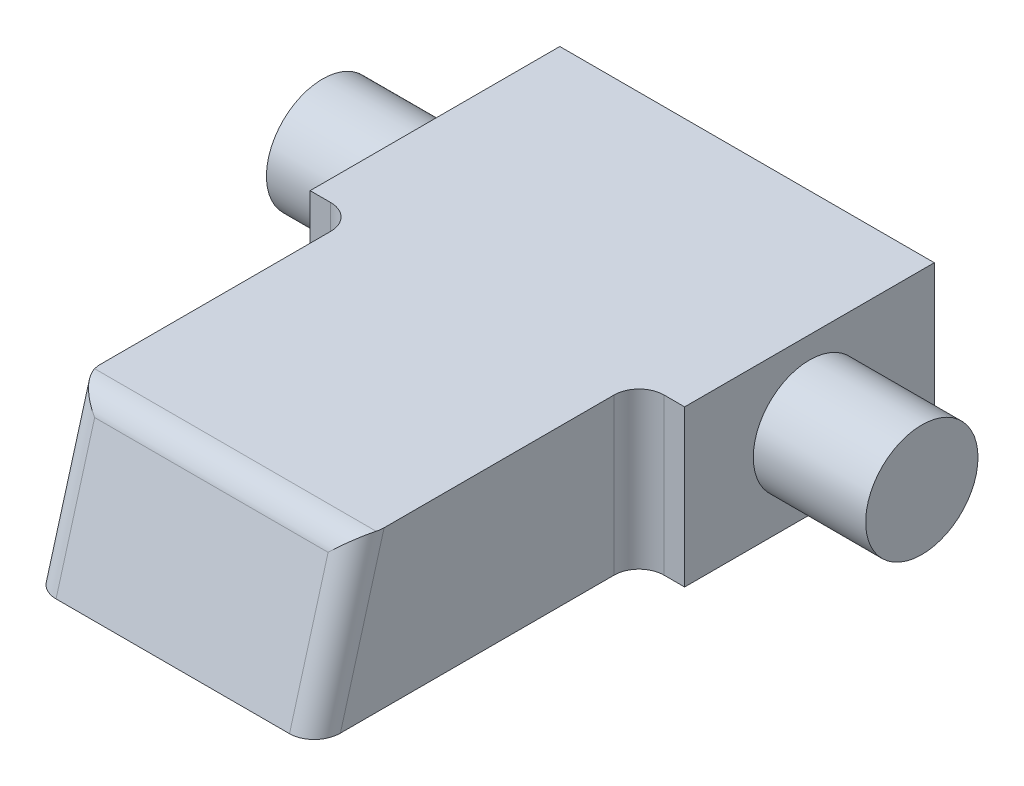
ISO-10303-21;
HEADER;
FILE_DESCRIPTION(('STEP AP214'),'2;1');
FILE_NAME('part.step','',(''),(''),'','','');
FILE_SCHEMA(('AUTOMOTIVE_DESIGN { 1 0 10303 214 1 1 1 1 }'));
ENDSEC;
DATA;
#1=APPLICATION_CONTEXT('core data for automotive mechanical design processes');
#2=APPLICATION_PROTOCOL_DEFINITION('international standard','automotive_design',2000,#1);
#3=PRODUCT_CONTEXT('',#1,'mechanical');
#4=PRODUCT('Part','Part','',(#3));
#5=PRODUCT_RELATED_PRODUCT_CATEGORY('part','',(#4));
#6=PRODUCT_DEFINITION_FORMATION('','',#4);
#7=PRODUCT_DEFINITION_CONTEXT('part definition',#1,'design');
#8=PRODUCT_DEFINITION('design','',#6,#7);
#9=PRODUCT_DEFINITION_SHAPE('','',#8);
#10=(LENGTH_UNIT() NAMED_UNIT(*) SI_UNIT(.MILLI.,.METRE.));
#11=(NAMED_UNIT(*) PLANE_ANGLE_UNIT() SI_UNIT($,.RADIAN.));
#12=(NAMED_UNIT(*) SI_UNIT($,.STERADIAN.) SOLID_ANGLE_UNIT());
#13=UNCERTAINTY_MEASURE_WITH_UNIT(LENGTH_MEASURE(1.E-05),#10,'distance_accuracy_value','');
#14=(GEOMETRIC_REPRESENTATION_CONTEXT(3) GLOBAL_UNCERTAINTY_ASSIGNED_CONTEXT((#13)) GLOBAL_UNIT_ASSIGNED_CONTEXT((#10,
#11,#12)) REPRESENTATION_CONTEXT('',''));
#15=CARTESIAN_POINT('',(0.,0.,0.));
#16=DIRECTION('',(0.,0.,1.));
#17=DIRECTION('',(1.,0.,0.));
#18=AXIS2_PLACEMENT_3D('',#15,#16,#17);
#19=CARTESIAN_POINT('',(15.,12.5,-10.));
#20=DIRECTION('',(-1.,0.,0.));
#21=DIRECTION('',(0.,0.,1.));
#22=AXIS2_PLACEMENT_3D('',#19,#20,#21);
#23=PLANE('',#22);
#24=CARTESIAN_POINT('',(15.,6.25,0.));
#25=DIRECTION('',(-1.,0.,0.));
#26=DIRECTION('',(0.,0.,1.));
#27=AXIS2_PLACEMENT_3D('',#24,#25,#26);
#28=CIRCLE('',#27,4.5);
#29=CARTESIAN_POINT('',(15.,6.25,4.5));
#30=VERTEX_POINT('',#29);
#31=EDGE_CURVE('E183',#30,#30,#28,.T.);
#32=ORIENTED_EDGE('',*,*,#31,.T.);
#33=EDGE_LOOP('',(#32));
#34=FACE_BOUND('',#33,.T.);
#35=DIRECTION('',(0.,0.,-1.));
#36=VECTOR('',#35,1.);
#37=CARTESIAN_POINT('',(15.,0.,-10.));
#38=LINE('',#37,#36);
#39=CARTESIAN_POINT('',(15.,0.,10.));
#40=VERTEX_POINT('',#39);
#41=CARTESIAN_POINT('',(15.,0.,-10.));
#42=VERTEX_POINT('',#41);
#43=EDGE_CURVE('E157',#40,#42,#38,.T.);
#44=ORIENTED_EDGE('',*,*,#43,.T.);
#45=DIRECTION('',(0.,-1.,0.));
#46=VECTOR('',#45,1.);
#47=CARTESIAN_POINT('',(15.,12.5,-10.));
#48=LINE('',#47,#46);
#49=CARTESIAN_POINT('',(15.,12.5,-10.));
#50=VERTEX_POINT('',#49);
#51=EDGE_CURVE('E139',#50,#42,#48,.T.);
#52=ORIENTED_EDGE('',*,*,#51,.F.);
#53=DIRECTION('',(0.,0.,-1.));
#54=VECTOR('',#53,1.);
#55=CARTESIAN_POINT('',(15.,12.5,-10.));
#56=LINE('',#55,#54);
#57=CARTESIAN_POINT('',(15.,12.5,10.));
#58=VERTEX_POINT('',#57);
#59=EDGE_CURVE('E145',#58,#50,#56,.T.);
#60=ORIENTED_EDGE('',*,*,#59,.F.);
#61=DIRECTION('',(0.,-1.,0.));
#62=VECTOR('',#61,1.);
#63=CARTESIAN_POINT('',(15.,12.5,10.));
#64=LINE('',#63,#62);
#65=EDGE_CURVE('E211',#58,#40,#64,.T.);
#66=ORIENTED_EDGE('',*,*,#65,.T.);
#67=EDGE_LOOP('',(#44,#52,#60,#66));
#68=FACE_BOUND('',#67,.T.);
#69=ADVANCED_FACE('F41',(#34,#68),#23,.F.);
#70=CARTESIAN_POINT('',(-15.,12.5,-10.));
#71=DIRECTION('',(0.,0.,1.));
#72=DIRECTION('',(1.,0.,0.));
#73=AXIS2_PLACEMENT_3D('',#70,#71,#72);
#74=PLANE('',#73);
#75=DIRECTION('',(-1.,0.,0.));
#76=VECTOR('',#75,1.);
#77=CARTESIAN_POINT('',(-15.,0.,-10.));
#78=LINE('',#77,#76);
#79=CARTESIAN_POINT('',(-15.,0.,-10.));
#80=VERTEX_POINT('',#79);
#81=EDGE_CURVE('E188',#42,#80,#78,.T.);
#82=ORIENTED_EDGE('',*,*,#81,.T.);
#83=DIRECTION('',(0.,-1.,0.));
#84=VECTOR('',#83,1.);
#85=CARTESIAN_POINT('',(-15.,12.5,-10.));
#86=LINE('',#85,#84);
#87=CARTESIAN_POINT('',(-15.,12.5,-10.));
#88=VERTEX_POINT('',#87);
#89=EDGE_CURVE('E142',#88,#80,#86,.T.);
#90=ORIENTED_EDGE('',*,*,#89,.F.);
#91=DIRECTION('',(-1.,0.,0.));
#92=VECTOR('',#91,1.);
#93=CARTESIAN_POINT('',(-15.,12.5,-10.));
#94=LINE('',#93,#92);
#95=EDGE_CURVE('E135',#50,#88,#94,.T.);
#96=ORIENTED_EDGE('',*,*,#95,.F.);
#97=ORIENTED_EDGE('',*,*,#51,.T.);
#98=EDGE_LOOP('',(#82,#90,#96,#97));
#99=FACE_BOUND('',#98,.T.);
#100=ADVANCED_FACE('F137',(#99),#74,.F.);
#101=CARTESIAN_POINT('',(-15.,12.5,-10.));
#102=DIRECTION('',(1.,0.,0.));
#103=DIRECTION('',(0.,0.,-1.));
#104=AXIS2_PLACEMENT_3D('',#101,#102,#103);
#105=PLANE('',#104);
#106=CARTESIAN_POINT('',(-15.,6.25,0.));
#107=DIRECTION('',(1.,0.,0.));
#108=DIRECTION('',(0.,0.,-1.));
#109=AXIS2_PLACEMENT_3D('',#106,#107,#108);
#110=CIRCLE('',#109,4.5);
#111=CARTESIAN_POINT('',(-15.,6.25,-4.5));
#112=VERTEX_POINT('',#111);
#113=EDGE_CURVE('E45',#112,#112,#110,.T.);
#114=ORIENTED_EDGE('',*,*,#113,.T.);
#115=EDGE_LOOP('',(#114));
#116=FACE_BOUND('',#115,.T.);
#117=DIRECTION('',(0.,0.,1.));
#118=VECTOR('',#117,1.);
#119=CARTESIAN_POINT('',(-15.,0.,-10.));
#120=LINE('',#119,#118);
#121=CARTESIAN_POINT('',(-15.,0.,10.));
#122=VERTEX_POINT('',#121);
#123=EDGE_CURVE('E190',#80,#122,#120,.T.);
#124=ORIENTED_EDGE('',*,*,#123,.T.);
#125=DIRECTION('',(0.,-1.,0.));
#126=VECTOR('',#125,1.);
#127=CARTESIAN_POINT('',(-15.,12.5,10.));
#128=LINE('',#127,#126);
#129=CARTESIAN_POINT('',(-15.,12.5,10.));
#130=VERTEX_POINT('',#129);
#131=EDGE_CURVE('E162',#130,#122,#128,.T.);
#132=ORIENTED_EDGE('',*,*,#131,.F.);
#133=DIRECTION('',(0.,0.,1.));
#134=VECTOR('',#133,1.);
#135=CARTESIAN_POINT('',(-15.,12.5,-10.));
#136=LINE('',#135,#134);
#137=EDGE_CURVE('E144',#88,#130,#136,.T.);
#138=ORIENTED_EDGE('',*,*,#137,.F.);
#139=ORIENTED_EDGE('',*,*,#89,.T.);
#140=EDGE_LOOP('',(#124,#132,#138,#139));
#141=FACE_BOUND('',#140,.T.);
#142=ADVANCED_FACE('F265',(#116,#141),#105,.F.);
#143=CARTESIAN_POINT('',(-15.,12.5,10.));
#144=DIRECTION('',(0.,0.,-1.));
#145=DIRECTION('',(-1.,0.,0.));
#146=AXIS2_PLACEMENT_3D('',#143,#144,#145);
#147=PLANE('',#146);
#148=DIRECTION('',(1.,0.,0.));
#149=VECTOR('',#148,1.);
#150=CARTESIAN_POINT('',(-15.,0.,10.));
#151=LINE('',#150,#149);
#152=CARTESIAN_POINT('',(-13.35,0.,10.));
#153=VERTEX_POINT('',#152);
#154=EDGE_CURVE('E196',#122,#153,#151,.T.);
#155=ORIENTED_EDGE('',*,*,#154,.T.);
#156=DIRECTION('',(0.,-1.,0.));
#157=VECTOR('',#156,1.);
#158=CARTESIAN_POINT('',(-13.35,12.5,10.));
#159=LINE('',#158,#157);
#160=CARTESIAN_POINT('',(-13.35,12.5,10.));
#161=VERTEX_POINT('',#160);
#162=EDGE_CURVE('E222',#161,#153,#159,.T.);
#163=ORIENTED_EDGE('',*,*,#162,.F.);
#164=DIRECTION('',(1.,0.,0.));
#165=VECTOR('',#164,1.);
#166=CARTESIAN_POINT('',(-15.,12.5,10.));
#167=LINE('',#166,#165);
#168=EDGE_CURVE('E231',#130,#161,#167,.T.);
#169=ORIENTED_EDGE('',*,*,#168,.F.);
#170=ORIENTED_EDGE('',*,*,#131,.T.);
#171=EDGE_LOOP('',(#155,#163,#169,#170));
#172=FACE_BOUND('',#171,.T.);
#173=ADVANCED_FACE('F229',(#172),#147,.F.);
#174=CARTESIAN_POINT('',(-13.35,12.5,12.));
#175=DIRECTION('',(0.,-1.,0.));
#176=DIRECTION('',(0.,0.,-1.));
#177=AXIS2_PLACEMENT_3D('',#174,#175,#176);
#178=CYLINDRICAL_SURFACE('',#177,2.);
#179=CARTESIAN_POINT('',(-13.35,0.,12.));
#180=DIRECTION('',(0.,-1.,0.));
#181=DIRECTION('',(0.,0.,-1.));
#182=AXIS2_PLACEMENT_3D('',#179,#180,#181);
#183=CIRCLE('',#182,2.);
#184=CARTESIAN_POINT('',(-11.35,0.,12.));
#185=VERTEX_POINT('',#184);
#186=EDGE_CURVE('E198',#153,#185,#183,.T.);
#187=ORIENTED_EDGE('',*,*,#186,.T.);
#188=DIRECTION('',(0.,-1.,0.));
#189=VECTOR('',#188,1.);
#190=CARTESIAN_POINT('',(-11.35,12.5,12.));
#191=LINE('',#190,#189);
#192=CARTESIAN_POINT('',(-11.35,12.5,12.));
#193=VERTEX_POINT('',#192);
#194=EDGE_CURVE('E219',#193,#185,#191,.T.);
#195=ORIENTED_EDGE('',*,*,#194,.F.);
#196=CARTESIAN_POINT('',(-13.35,12.5,12.));
#197=DIRECTION('',(0.,-1.,0.));
#198=DIRECTION('',(0.,0.,-1.));
#199=AXIS2_PLACEMENT_3D('',#196,#197,#198);
#200=CIRCLE('',#199,2.);
#201=EDGE_CURVE('E249',#161,#193,#200,.T.);
#202=ORIENTED_EDGE('',*,*,#201,.F.);
#203=ORIENTED_EDGE('',*,*,#162,.T.);
#204=EDGE_LOOP('',(#187,#195,#202,#203));
#205=FACE_BOUND('',#204,.T.);
#206=ADVANCED_FACE('F241',(#205),#178,.F.);
#207=CARTESIAN_POINT('',(-11.35,12.5,12.));
#208=DIRECTION('',(1.,0.,0.));
#209=DIRECTION('',(0.,0.,-1.));
#210=AXIS2_PLACEMENT_3D('',#207,#208,#209);
#211=PLANE('',#210);
#212=DIRECTION('',(0.,0.,1.));
#213=VECTOR('',#212,1.);
#214=CARTESIAN_POINT('',(-11.35,0.,12.));
#215=LINE('',#214,#213);
#216=CARTESIAN_POINT('',(-11.35,0.,33.9230792022805));
#217=VERTEX_POINT('',#216);
#218=EDGE_CURVE('E200',#185,#217,#215,.T.);
#219=ORIENTED_EDGE('',*,*,#218,.T.);
#220=DIRECTION('',(0.,-0.962964019714182,0.269629925519971));
#221=VECTOR('',#220,1.);
#222=CARTESIAN_POINT('',(-11.35,17.283440445696,29.0837158774856));
#223=LINE('',#222,#221);
#224=CARTESIAN_POINT('',(-11.35,12.5,30.4230792022805));
#225=VERTEX_POINT('',#224);
#226=EDGE_CURVE('E174',#217,#225,#223,.F.);
#227=ORIENTED_EDGE('',*,*,#226,.T.);
#228=DIRECTION('',(0.,0.,1.));
#229=VECTOR('',#228,1.);
#230=CARTESIAN_POINT('',(-11.35,12.5,12.));
#231=LINE('',#230,#229);
#232=EDGE_CURVE('E247',#193,#225,#231,.T.);
#233=ORIENTED_EDGE('',*,*,#232,.F.);
#234=ORIENTED_EDGE('',*,*,#194,.T.);
#235=EDGE_LOOP('',(#219,#227,#233,#234));
#236=FACE_BOUND('',#235,.T.);
#237=ADVANCED_FACE('F245',(#236),#211,.F.);
#238=CARTESIAN_POINT('',(11.35,12.5,12.));
#239=DIRECTION('',(-1.,0.,0.));
#240=DIRECTION('',(0.,0.,1.));
#241=AXIS2_PLACEMENT_3D('',#238,#239,#240);
#242=PLANE('',#241);
#243=DIRECTION('',(0.,0.,-1.));
#244=VECTOR('',#243,1.);
#245=CARTESIAN_POINT('',(11.35,12.5,12.));
#246=LINE('',#245,#244);
#247=CARTESIAN_POINT('',(11.35,12.5,30.4230792022805));
#248=VERTEX_POINT('',#247);
#249=CARTESIAN_POINT('',(11.35,12.5,12.));
#250=VERTEX_POINT('',#249);
#251=EDGE_CURVE('E248',#248,#250,#246,.T.);
#252=ORIENTED_EDGE('',*,*,#251,.F.);
#253=DIRECTION('',(0.,-0.962964019714182,0.269629925519971));
#254=VECTOR('',#253,1.);
#255=CARTESIAN_POINT('',(11.35,17.283440445696,29.0837158774856));
#256=LINE('',#255,#254);
#257=CARTESIAN_POINT('',(11.35,0.,33.9230792022805));
#258=VERTEX_POINT('',#257);
#259=EDGE_CURVE('E11',#248,#258,#256,.T.);
#260=ORIENTED_EDGE('',*,*,#259,.T.);
#261=DIRECTION('',(0.,0.,-1.));
#262=VECTOR('',#261,1.);
#263=CARTESIAN_POINT('',(11.35,0.,12.));
#264=LINE('',#263,#262);
#265=CARTESIAN_POINT('',(11.35,0.,12.));
#266=VERTEX_POINT('',#265);
#267=EDGE_CURVE('E206',#258,#266,#264,.T.);
#268=ORIENTED_EDGE('',*,*,#267,.T.);
#269=DIRECTION('',(0.,-1.,0.));
#270=VECTOR('',#269,1.);
#271=CARTESIAN_POINT('',(11.35,12.5,12.));
#272=LINE('',#271,#270);
#273=EDGE_CURVE('E216',#250,#266,#272,.T.);
#274=ORIENTED_EDGE('',*,*,#273,.F.);
#275=EDGE_LOOP('',(#252,#260,#268,#274));
#276=FACE_BOUND('',#275,.T.);
#277=ADVANCED_FACE('F315',(#276),#242,.F.);
#278=CARTESIAN_POINT('',(13.35,12.5,12.));
#279=DIRECTION('',(0.,-1.,0.));
#280=DIRECTION('',(0.,0.,-1.));
#281=AXIS2_PLACEMENT_3D('',#278,#279,#280);
#282=CYLINDRICAL_SURFACE('',#281,2.);
#283=CARTESIAN_POINT('',(13.35,0.,12.));
#284=DIRECTION('',(0.,-1.,0.));
#285=DIRECTION('',(0.,0.,1.));
#286=AXIS2_PLACEMENT_3D('',#283,#284,#285);
#287=CIRCLE('',#286,2.);
#288=CARTESIAN_POINT('',(13.35,0.,10.));
#289=VERTEX_POINT('',#288);
#290=EDGE_CURVE('E208',#266,#289,#287,.T.);
#291=ORIENTED_EDGE('',*,*,#290,.T.);
#292=DIRECTION('',(0.,-1.,0.));
#293=VECTOR('',#292,1.);
#294=CARTESIAN_POINT('',(13.35,12.5,10.));
#295=LINE('',#294,#293);
#296=CARTESIAN_POINT('',(13.35,12.5,10.));
#297=VERTEX_POINT('',#296);
#298=EDGE_CURVE('E213',#297,#289,#295,.T.);
#299=ORIENTED_EDGE('',*,*,#298,.F.);
#300=CARTESIAN_POINT('',(13.35,12.5,12.));
#301=DIRECTION('',(0.,-1.,0.));
#302=DIRECTION('',(0.,0.,1.));
#303=AXIS2_PLACEMENT_3D('',#300,#301,#302);
#304=CIRCLE('',#303,2.);
#305=EDGE_CURVE('E251',#250,#297,#304,.T.);
#306=ORIENTED_EDGE('',*,*,#305,.F.);
#307=ORIENTED_EDGE('',*,*,#273,.T.);
#308=EDGE_LOOP('',(#291,#299,#306,#307));
#309=FACE_BOUND('',#308,.T.);
#310=ADVANCED_FACE('F260',(#309),#282,.F.);
#311=CARTESIAN_POINT('',(13.35,12.5,10.));
#312=DIRECTION('',(0.,0.,-1.));
#313=DIRECTION('',(-1.,0.,0.));
#314=AXIS2_PLACEMENT_3D('',#311,#312,#313);
#315=PLANE('',#314);
#316=DIRECTION('',(1.,0.,0.));
#317=VECTOR('',#316,1.);
#318=CARTESIAN_POINT('',(13.35,0.,10.));
#319=LINE('',#318,#317);
#320=EDGE_CURVE('E154',#289,#40,#319,.T.);
#321=ORIENTED_EDGE('',*,*,#320,.T.);
#322=ORIENTED_EDGE('',*,*,#65,.F.);
#323=DIRECTION('',(1.,0.,0.));
#324=VECTOR('',#323,1.);
#325=CARTESIAN_POINT('',(13.35,12.5,10.));
#326=LINE('',#325,#324);
#327=EDGE_CURVE('E150',#297,#58,#326,.T.);
#328=ORIENTED_EDGE('',*,*,#327,.F.);
#329=ORIENTED_EDGE('',*,*,#298,.T.);
#330=EDGE_LOOP('',(#321,#322,#328,#329));
#331=FACE_BOUND('',#330,.T.);
#332=ADVANCED_FACE('F264',(#331),#315,.F.);
#333=CARTESIAN_POINT('',(13.35,12.5,12.));
#334=DIRECTION('',(0.,1.,0.));
#335=DIRECTION('',(0.,0.,1.));
#336=AXIS2_PLACEMENT_3D('',#333,#334,#335);
#337=PLANE('',#336);
#338=ORIENTED_EDGE('',*,*,#232,.T.);
#339=CARTESIAN_POINT('',(-9.35,12.5,30.4230792022805));
#340=DIRECTION('',(0.,1.,0.));
#341=DIRECTION('',(0.,0.,1.));
#342=AXIS2_PLACEMENT_3D('',#339,#340,#341);
#343=ELLIPSE('',#342,2.07692079771955,2.);
#344=CARTESIAN_POINT('',(-11.2759280394284,12.5,30.9830792022805));
#345=VERTEX_POINT('',#344);
#346=EDGE_CURVE('E50',#225,#345,#343,.T.);
#347=ORIENTED_EDGE('',*,*,#346,.T.);
#348=DIRECTION('',(1.,0.,0.));
#349=VECTOR('',#348,1.);
#350=CARTESIAN_POINT('',(11.35,12.5,30.9830792022805));
#351=LINE('',#350,#349);
#352=CARTESIAN_POINT('',(11.2759280394284,12.5,30.9830792022805));
#353=VERTEX_POINT('',#352);
#354=EDGE_CURVE('E58',#345,#353,#351,.T.);
#355=ORIENTED_EDGE('',*,*,#354,.T.);
#356=CARTESIAN_POINT('',(9.34999999999999,12.5,30.4230792022805));
#357=DIRECTION('',(0.,1.,0.));
#358=DIRECTION('',(0.,0.,1.));
#359=AXIS2_PLACEMENT_3D('',#356,#357,#358);
#360=ELLIPSE('',#359,2.07692079771955,2.);
#361=EDGE_CURVE('E177',#353,#248,#360,.T.);
#362=ORIENTED_EDGE('',*,*,#361,.T.);
#363=ORIENTED_EDGE('',*,*,#251,.T.);
#364=ORIENTED_EDGE('',*,*,#305,.T.);
#365=ORIENTED_EDGE('',*,*,#327,.T.);
#366=ORIENTED_EDGE('',*,*,#59,.T.);
#367=ORIENTED_EDGE('',*,*,#95,.T.);
#368=ORIENTED_EDGE('',*,*,#137,.T.);
#369=ORIENTED_EDGE('',*,*,#168,.T.);
#370=ORIENTED_EDGE('',*,*,#201,.T.);
#371=EDGE_LOOP('',(#338,#347,#355,#362,#363,#364,#365,#366,#367,#368,#369,#370));
#372=FACE_BOUND('',#371,.T.);
#373=ADVANCED_FACE('F148',(#372),#337,.T.);
#374=CARTESIAN_POINT('',(13.35,0.,12.));
#375=DIRECTION('',(0.,1.,0.));
#376=DIRECTION('',(0.,0.,1.));
#377=AXIS2_PLACEMENT_3D('',#374,#375,#376);
#378=PLANE('',#377);
#379=DIRECTION('',(1.,0.,0.));
#380=VECTOR('',#379,1.);
#381=CARTESIAN_POINT('',(-11.35,0.,36.));
#382=LINE('',#381,#380);
#383=CARTESIAN_POINT('',(-9.35,0.,36.));
#384=VERTEX_POINT('',#383);
#385=CARTESIAN_POINT('',(9.34999999999999,0.,36.));
#386=VERTEX_POINT('',#385);
#387=EDGE_CURVE('E203',#384,#386,#382,.T.);
#388=ORIENTED_EDGE('',*,*,#387,.F.);
#389=CARTESIAN_POINT('',(-9.35,0.,33.9230792022805));
#390=DIRECTION('',(0.,1.,0.));
#391=DIRECTION('',(0.,0.,1.));
#392=AXIS2_PLACEMENT_3D('',#389,#390,#391);
#393=ELLIPSE('',#392,2.07692079771955,2.);
#394=EDGE_CURVE('E172',#384,#217,#393,.F.);
#395=ORIENTED_EDGE('',*,*,#394,.T.);
#396=ORIENTED_EDGE('',*,*,#218,.F.);
#397=ORIENTED_EDGE('',*,*,#186,.F.);
#398=ORIENTED_EDGE('',*,*,#154,.F.);
#399=ORIENTED_EDGE('',*,*,#123,.F.);
#400=ORIENTED_EDGE('',*,*,#81,.F.);
#401=ORIENTED_EDGE('',*,*,#43,.F.);
#402=ORIENTED_EDGE('',*,*,#320,.F.);
#403=ORIENTED_EDGE('',*,*,#290,.F.);
#404=ORIENTED_EDGE('',*,*,#267,.F.);
#405=CARTESIAN_POINT('',(9.34999999999999,0.,33.9230792022804));
#406=DIRECTION('',(0.,1.,0.));
#407=DIRECTION('',(0.,0.,1.));
#408=AXIS2_PLACEMENT_3D('',#405,#406,#407);
#409=ELLIPSE('',#408,2.07692079771955,2.);
#410=EDGE_CURVE('E170',#258,#386,#409,.F.);
#411=ORIENTED_EDGE('',*,*,#410,.T.);
#412=EDGE_LOOP('',(#388,#395,#396,#397,#398,#399,#400,#401,#402,#403,#404,#411));
#413=FACE_BOUND('',#412,.T.);
#414=ADVANCED_FACE('F237',(#413),#378,.F.);
#415=CARTESIAN_POINT('',(-24.3307549857472,0.,36.));
#416=DIRECTION('',(0.,-0.269629925519971,-0.962964019714182));
#417=DIRECTION('',(0.,0.962964019714182,-0.269629925519971));
#418=AXIS2_PLACEMENT_3D('',#415,#416,#417);
#419=PLANE('',#418);
#420=DIRECTION('',(1.,0.,0.));
#421=VECTOR('',#420,1.);
#422=CARTESIAN_POINT('',(-11.35,11.0392598510399,32.9090072417088));
#423=LINE('',#422,#421);
#424=CARTESIAN_POINT('',(9.34999999999999,11.0392598510399,32.9090072417088));
#425=VERTEX_POINT('',#424);
#426=CARTESIAN_POINT('',(-9.35,11.0392598510399,32.9090072417088));
#427=VERTEX_POINT('',#426);
#428=EDGE_CURVE('E158',#425,#427,#423,.F.);
#429=ORIENTED_EDGE('',*,*,#428,.T.);
#430=DIRECTION('',(0.,-0.962964019714182,0.269629925519971));
#431=VECTOR('',#430,1.);
#432=CARTESIAN_POINT('',(-9.35,0.,36.));
#433=LINE('',#432,#431);
#434=EDGE_CURVE('E167',#427,#384,#433,.T.);
#435=ORIENTED_EDGE('',*,*,#434,.T.);
#436=ORIENTED_EDGE('',*,*,#387,.T.);
#437=DIRECTION('',(0.,-0.962964019714182,0.269629925519971));
#438=VECTOR('',#437,1.);
#439=CARTESIAN_POINT('',(9.34999999999999,0.,36.));
#440=LINE('',#439,#438);
#441=EDGE_CURVE('E160',#386,#425,#440,.F.);
#442=ORIENTED_EDGE('',*,*,#441,.T.);
#443=EDGE_LOOP('',(#429,#435,#436,#442));
#444=FACE_BOUND('',#443,.T.);
#445=ADVANCED_FACE('F303',(#444),#419,.F.);
#446=CARTESIAN_POINT('',(9.34999999999999,17.283440445696,29.0837158774856));
#447=DIRECTION('',(0.,-0.962964019714182,0.269629925519971));
#448=DIRECTION('',(0.,-0.269629925519971,-0.962964019714182));
#449=AXIS2_PLACEMENT_3D('',#446,#447,#448);
#450=CYLINDRICAL_SURFACE('',#449,2.);
#451=ORIENTED_EDGE('',*,*,#259,.F.);
#452=ORIENTED_EDGE('',*,*,#361,.F.);
#453=CARTESIAN_POINT('',(9.34999999999999,10.5,30.9830792022805));
#454=DIRECTION('',(-0.707106781186547,0.680918388378554,-0.190657148745995));
#455=DIRECTION('',(-0.707106781186547,-0.680918388378554,0.190657148745995));
#456=AXIS2_PLACEMENT_3D('',#453,#454,#455);
#457=ELLIPSE('',#456,2.82842712474619,2.);
#458=EDGE_CURVE('E182',#425,#353,#457,.T.);
#459=ORIENTED_EDGE('',*,*,#458,.F.);
#460=ORIENTED_EDGE('',*,*,#441,.F.);
#461=ORIENTED_EDGE('',*,*,#410,.F.);
#462=EDGE_LOOP('',(#451,#452,#459,#460,#461));
#463=FACE_BOUND('',#462,.T.);
#464=ADVANCED_FACE('F43',(#463),#450,.T.);
#465=CARTESIAN_POINT('',(13.35,10.5,30.9830792022805));
#466=DIRECTION('',(-1.,0.,0.));
#467=DIRECTION('',(0.,0.,1.));
#468=AXIS2_PLACEMENT_3D('',#465,#466,#467);
#469=CYLINDRICAL_SURFACE('',#468,2.);
#470=ORIENTED_EDGE('',*,*,#458,.T.);
#471=ORIENTED_EDGE('',*,*,#354,.F.);
#472=CARTESIAN_POINT('',(-9.35,10.5,30.9830792022805));
#473=DIRECTION('',(-0.707106781186547,-0.680918388378554,0.190657148745995));
#474=DIRECTION('',(-0.707106781186547,0.680918388378554,-0.190657148745995));
#475=AXIS2_PLACEMENT_3D('',#472,#473,#474);
#476=ELLIPSE('',#475,2.82842712474619,2.);
#477=EDGE_CURVE('E180',#427,#345,#476,.T.);
#478=ORIENTED_EDGE('',*,*,#477,.F.);
#479=ORIENTED_EDGE('',*,*,#428,.F.);
#480=EDGE_LOOP('',(#470,#471,#478,#479));
#481=FACE_BOUND('',#480,.T.);
#482=ADVANCED_FACE('F297',(#481),#469,.T.);
#483=CARTESIAN_POINT('',(-9.35,-0.539259851039942,34.0740719605716));
#484=DIRECTION('',(0.,-0.962964019714182,0.269629925519971));
#485=DIRECTION('',(0.,-0.269629925519971,-0.962964019714182));
#486=AXIS2_PLACEMENT_3D('',#483,#484,#485);
#487=CYLINDRICAL_SURFACE('',#486,2.);
#488=ORIENTED_EDGE('',*,*,#346,.F.);
#489=ORIENTED_EDGE('',*,*,#226,.F.);
#490=ORIENTED_EDGE('',*,*,#394,.F.);
#491=ORIENTED_EDGE('',*,*,#434,.F.);
#492=ORIENTED_EDGE('',*,*,#477,.T.);
#493=EDGE_LOOP('',(#488,#489,#490,#491,#492));
#494=FACE_BOUND('',#493,.T.);
#495=ADVANCED_FACE('F294',(#494),#487,.T.);
#496=CARTESIAN_POINT('',(-24.,6.25,0.));
#497=DIRECTION('',(1.,0.,0.));
#498=DIRECTION('',(0.,0.,-1.));
#499=AXIS2_PLACEMENT_3D('',#496,#497,#498);
#500=PLANE('',#499);
#501=CARTESIAN_POINT('',(-24.,6.25,0.));
#502=DIRECTION('',(1.,0.,0.));
#503=DIRECTION('',(0.,0.,-1.));
#504=AXIS2_PLACEMENT_3D('',#501,#502,#503);
#505=CIRCLE('',#504,4.5);
#506=CARTESIAN_POINT('',(-24.,6.25,-4.5));
#507=VERTEX_POINT('',#506);
#508=EDGE_CURVE('E270',#507,#507,#505,.T.);
#509=ORIENTED_EDGE('',*,*,#508,.F.);
#510=EDGE_LOOP('',(#509));
#511=FACE_BOUND('',#510,.T.);
#512=ADVANCED_FACE('F296',(#511),#500,.F.);
#513=CARTESIAN_POINT('',(-24.,6.25,0.));
#514=DIRECTION('',(1.,0.,0.));
#515=DIRECTION('',(0.,0.,-1.));
#516=AXIS2_PLACEMENT_3D('',#513,#514,#515);
#517=CYLINDRICAL_SURFACE('',#516,4.5);
#518=ORIENTED_EDGE('',*,*,#508,.T.);
#519=EDGE_LOOP('',(#518));
#520=FACE_BOUND('',#519,.T.);
#521=ORIENTED_EDGE('',*,*,#113,.F.);
#522=EDGE_LOOP('',(#521));
#523=FACE_BOUND('',#522,.T.);
#524=ADVANCED_FACE('F282',(#520,#523),#517,.T.);
#525=CARTESIAN_POINT('',(24.,6.25,0.));
#526=DIRECTION('',(1.,0.,0.));
#527=DIRECTION('',(0.,0.,-1.));
#528=AXIS2_PLACEMENT_3D('',#525,#526,#527);
#529=CIRCLE('',#528,4.5);
#530=CARTESIAN_POINT('',(24.,6.25,-4.5));
#531=VERTEX_POINT('',#530);
#532=EDGE_CURVE('E273',#531,#531,#529,.T.);
#533=ORIENTED_EDGE('',*,*,#532,.F.);
#534=EDGE_LOOP('',(#533));
#535=FACE_BOUND('',#534,.T.);
#536=ORIENTED_EDGE('',*,*,#31,.F.);
#537=EDGE_LOOP('',(#536));
#538=FACE_BOUND('',#537,.T.);
#539=ADVANCED_FACE('F279',(#535,#538),#517,.T.);
#540=CARTESIAN_POINT('',(24.,6.25,0.));
#541=DIRECTION('',(1.,0.,0.));
#542=DIRECTION('',(0.,0.,-1.));
#543=AXIS2_PLACEMENT_3D('',#540,#541,#542);
#544=PLANE('',#543);
#545=ORIENTED_EDGE('',*,*,#532,.T.);
#546=EDGE_LOOP('',(#545));
#547=FACE_BOUND('',#546,.T.);
#548=ADVANCED_FACE('F277',(#547),#544,.T.);
#549=CLOSED_SHELL('',(#69,#100,#142,#173,#206,#237,#277,#310,#332,#373,#414,#445,#464,#482,#495,
#512,#524,#539,#548));
#550=MANIFOLD_SOLID_BREP('B2',#549);
#551=ADVANCED_BREP_SHAPE_REPRESENTATION('',(#18,#550),#14);
#552=SHAPE_DEFINITION_REPRESENTATION(#9,#551);
ENDSEC;
END-ISO-10303-21;
